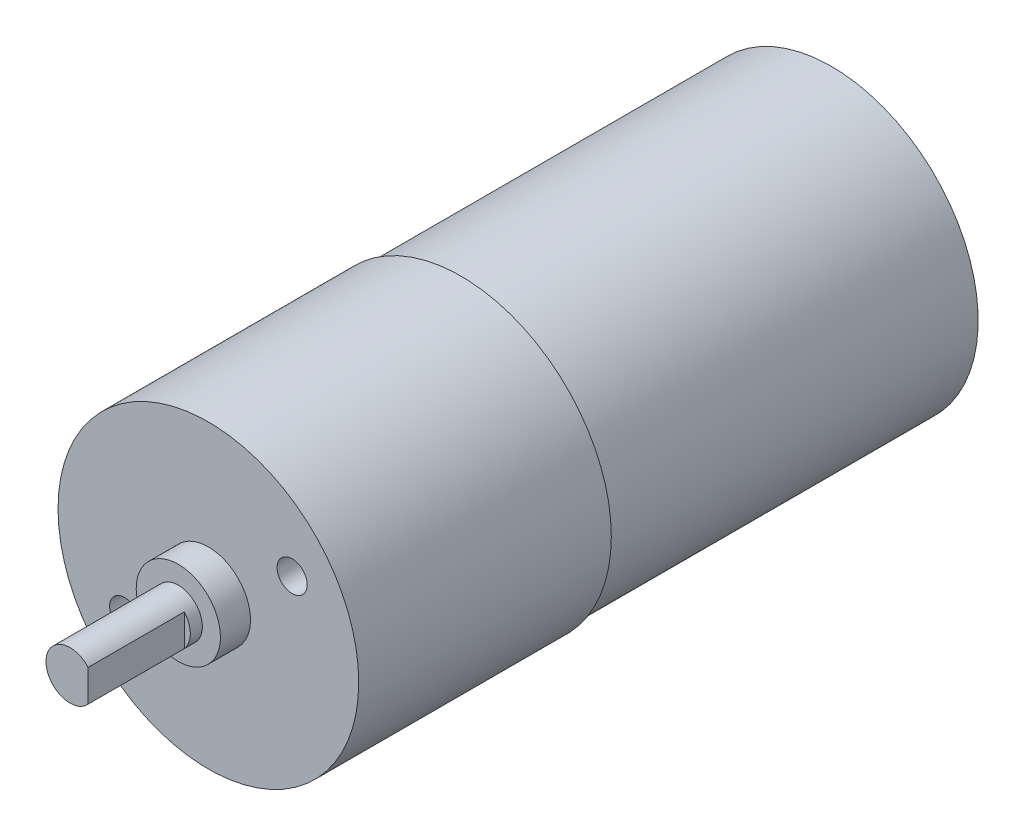
ISO-10303-21;
HEADER;
FILE_DESCRIPTION(('STEP AP214'),'2;1');
FILE_NAME('part.step','',(''),(''),'','','');
FILE_SCHEMA(('AUTOMOTIVE_DESIGN { 1 0 10303 214 1 1 1 1 }'));
ENDSEC;
DATA;
#1=APPLICATION_CONTEXT('core data for automotive mechanical design processes');
#2=APPLICATION_PROTOCOL_DEFINITION('international standard','automotive_design',2000,#1);
#3=PRODUCT_CONTEXT('',#1,'mechanical');
#4=PRODUCT('Part','Part','',(#3));
#5=PRODUCT_RELATED_PRODUCT_CATEGORY('part','',(#4));
#6=PRODUCT_DEFINITION_FORMATION('','',#4);
#7=PRODUCT_DEFINITION_CONTEXT('part definition',#1,'design');
#8=PRODUCT_DEFINITION('design','',#6,#7);
#9=PRODUCT_DEFINITION_SHAPE('','',#8);
#10=(LENGTH_UNIT() NAMED_UNIT(*) SI_UNIT(.MILLI.,.METRE.));
#11=(NAMED_UNIT(*) PLANE_ANGLE_UNIT() SI_UNIT($,.RADIAN.));
#12=(NAMED_UNIT(*) SI_UNIT($,.STERADIAN.) SOLID_ANGLE_UNIT());
#13=UNCERTAINTY_MEASURE_WITH_UNIT(LENGTH_MEASURE(1.E-05),#10,'distance_accuracy_value','');
#14=(GEOMETRIC_REPRESENTATION_CONTEXT(3) GLOBAL_UNCERTAINTY_ASSIGNED_CONTEXT((#13)) GLOBAL_UNIT_ASSIGNED_CONTEXT((#10,
#11,#12)) REPRESENTATION_CONTEXT('',''));
#15=CARTESIAN_POINT('',(0.,0.,0.));
#16=DIRECTION('',(0.,0.,1.));
#17=DIRECTION('',(1.,0.,0.));
#18=AXIS2_PLACEMENT_3D('',#15,#16,#17);
#19=CARTESIAN_POINT('',(0.,0.,11.5));
#20=DIRECTION('',(0.,0.,-1.));
#21=DIRECTION('',(-1.,0.,0.));
#22=AXIS2_PLACEMENT_3D('',#19,#20,#21);
#23=PLANE('',#22);
#24=CARTESIAN_POINT('',(0.,0.,11.5));
#25=DIRECTION('',(0.,0.,-1.));
#26=DIRECTION('',(-1.,0.,0.));
#27=AXIS2_PLACEMENT_3D('',#24,#25,#26);
#28=CIRCLE('',#27,2.);
#29=CARTESIAN_POINT('',(1.5,-1.3228756555323,11.5));
#30=VERTEX_POINT('',#29);
#31=CARTESIAN_POINT('',(1.5,1.3228756555323,11.5));
#32=VERTEX_POINT('',#31);
#33=EDGE_CURVE('E70',#30,#32,#28,.T.);
#34=ORIENTED_EDGE('',*,*,#33,.F.);
#35=DIRECTION('',(0.,1.,0.));
#36=VECTOR('',#35,1.);
#37=CARTESIAN_POINT('',(1.5,0.,11.5));
#38=LINE('',#37,#36);
#39=EDGE_CURVE('E69',#30,#32,#38,.T.);
#40=ORIENTED_EDGE('',*,*,#39,.T.);
#41=EDGE_LOOP('',(#34,#40));
#42=FACE_BOUND('',#41,.T.);
#43=ADVANCED_FACE('F39',(#42),#23,.F.);
#44=CARTESIAN_POINT('',(0.,0.,-60.));
#45=DIRECTION('',(0.,0.,-1.));
#46=DIRECTION('',(-1.,0.,0.));
#47=AXIS2_PLACEMENT_3D('',#44,#45,#46);
#48=CYLINDRICAL_SURFACE('',#47,2.);
#49=ORIENTED_EDGE('',*,*,#33,.T.);
#50=DIRECTION('',(0.,0.,-1.));
#51=VECTOR('',#50,1.);
#52=CARTESIAN_POINT('',(1.5,1.3228756555323,-60.));
#53=LINE('',#52,#51);
#54=CARTESIAN_POINT('',(1.5,1.3228756555323,3.5));
#55=VERTEX_POINT('',#54);
#56=EDGE_CURVE('E11',#32,#55,#53,.T.);
#57=ORIENTED_EDGE('',*,*,#56,.T.);
#58=CARTESIAN_POINT('',(0.,0.,3.5));
#59=DIRECTION('',(0.,0.,-1.));
#60=DIRECTION('',(-1.,0.,0.));
#61=AXIS2_PLACEMENT_3D('',#58,#59,#60);
#62=CIRCLE('',#61,2.);
#63=CARTESIAN_POINT('',(1.5,-1.3228756555323,3.5));
#64=VERTEX_POINT('',#63);
#65=EDGE_CURVE('E64',#55,#64,#62,.T.);
#66=ORIENTED_EDGE('',*,*,#65,.T.);
#67=DIRECTION('',(0.,0.,-1.));
#68=VECTOR('',#67,1.);
#69=CARTESIAN_POINT('',(1.5,-1.3228756555323,-60.));
#70=LINE('',#69,#68);
#71=EDGE_CURVE('E46',#64,#30,#70,.F.);
#72=ORIENTED_EDGE('',*,*,#71,.T.);
#73=EDGE_LOOP('',(#49,#57,#66,#72));
#74=FACE_BOUND('',#73,.T.);
#75=CARTESIAN_POINT('',(0.,0.,2.5));
#76=DIRECTION('',(0.,0.,-1.));
#77=DIRECTION('',(-1.,0.,0.));
#78=AXIS2_PLACEMENT_3D('',#75,#76,#77);
#79=CIRCLE('',#78,2.);
#80=CARTESIAN_POINT('',(-2.,0.,2.5));
#81=VERTEX_POINT('',#80);
#82=EDGE_CURVE('E78',#81,#81,#79,.T.);
#83=ORIENTED_EDGE('',*,*,#82,.F.);
#84=EDGE_LOOP('',(#83));
#85=FACE_BOUND('',#84,.T.);
#86=ADVANCED_FACE('F73',(#74,#85),#48,.T.);
#87=CARTESIAN_POINT('',(2.,0.,2.5));
#88=DIRECTION('',(0.,0.,-1.));
#89=DIRECTION('',(-1.,0.,0.));
#90=AXIS2_PLACEMENT_3D('',#87,#88,#89);
#91=PLANE('',#90);
#92=CARTESIAN_POINT('',(0.,0.,2.5));
#93=DIRECTION('',(0.,0.,-1.));
#94=DIRECTION('',(-1.,0.,0.));
#95=AXIS2_PLACEMENT_3D('',#92,#93,#94);
#96=CIRCLE('',#95,3.5);
#97=CARTESIAN_POINT('',(-3.5,0.,2.5));
#98=VERTEX_POINT('',#97);
#99=EDGE_CURVE('E82',#98,#98,#96,.T.);
#100=ORIENTED_EDGE('',*,*,#99,.F.);
#101=EDGE_LOOP('',(#100));
#102=FACE_BOUND('',#101,.T.);
#103=ORIENTED_EDGE('',*,*,#82,.T.);
#104=EDGE_LOOP('',(#103));
#105=FACE_BOUND('',#104,.T.);
#106=ADVANCED_FACE('F140',(#102,#105),#91,.F.);
#107=CARTESIAN_POINT('',(0.,0.,-60.));
#108=DIRECTION('',(0.,0.,-1.));
#109=DIRECTION('',(-1.,0.,0.));
#110=AXIS2_PLACEMENT_3D('',#107,#108,#109);
#111=CYLINDRICAL_SURFACE('',#110,3.5);
#112=CARTESIAN_POINT('',(0.,0.,0.));
#113=DIRECTION('',(0.,0.,-1.));
#114=DIRECTION('',(-1.,0.,0.));
#115=AXIS2_PLACEMENT_3D('',#112,#113,#114);
#116=CIRCLE('',#115,3.5);
#117=CARTESIAN_POINT('',(-3.5,0.,0.));
#118=VERTEX_POINT('',#117);
#119=EDGE_CURVE('E87',#118,#118,#116,.T.);
#120=ORIENTED_EDGE('',*,*,#119,.F.);
#121=EDGE_LOOP('',(#120));
#122=FACE_BOUND('',#121,.T.);
#123=ORIENTED_EDGE('',*,*,#99,.T.);
#124=EDGE_LOOP('',(#123));
#125=FACE_BOUND('',#124,.T.);
#126=ADVANCED_FACE('F130',(#122,#125),#111,.T.);
#127=CARTESIAN_POINT('',(3.5,0.,0.));
#128=DIRECTION('',(0.,0.,-1.));
#129=DIRECTION('',(-1.,0.,0.));
#130=AXIS2_PLACEMENT_3D('',#127,#128,#129);
#131=PLANE('',#130);
#132=CARTESIAN_POINT('',(6.96279237645643,4.87539970898389,0.));
#133=DIRECTION('',(0.,0.,1.));
#134=DIRECTION('',(1.,0.,0.));
#135=AXIS2_PLACEMENT_3D('',#132,#133,#134);
#136=CIRCLE('',#135,1.25);
#137=CARTESIAN_POINT('',(8.21279237645643,4.87539970898389,0.));
#138=VERTEX_POINT('',#137);
#139=EDGE_CURVE('E106',#138,#138,#136,.T.);
#140=ORIENTED_EDGE('',*,*,#139,.F.);
#141=EDGE_LOOP('',(#140));
#142=FACE_BOUND('',#141,.T.);
#143=CARTESIAN_POINT('',(-6.96279237645643,-4.87539970898389,0.));
#144=DIRECTION('',(0.,0.,1.));
#145=DIRECTION('',(1.,0.,0.));
#146=AXIS2_PLACEMENT_3D('',#143,#144,#145);
#147=CIRCLE('',#146,1.25);
#148=CARTESIAN_POINT('',(-5.71279237645643,-4.87539970898389,0.));
#149=VERTEX_POINT('',#148);
#150=EDGE_CURVE('E101',#149,#149,#147,.T.);
#151=ORIENTED_EDGE('',*,*,#150,.F.);
#152=EDGE_LOOP('',(#151));
#153=FACE_BOUND('',#152,.T.);
#154=CARTESIAN_POINT('',(0.,0.,0.));
#155=DIRECTION('',(0.,0.,-1.));
#156=DIRECTION('',(-1.,0.,0.));
#157=AXIS2_PLACEMENT_3D('',#154,#155,#156);
#158=CIRCLE('',#157,12.5);
#159=CARTESIAN_POINT('',(-12.5,0.,0.));
#160=VERTEX_POINT('',#159);
#161=EDGE_CURVE('E86',#160,#160,#158,.T.);
#162=ORIENTED_EDGE('',*,*,#161,.F.);
#163=EDGE_LOOP('',(#162));
#164=FACE_BOUND('',#163,.T.);
#165=ORIENTED_EDGE('',*,*,#119,.T.);
#166=EDGE_LOOP('',(#165));
#167=FACE_BOUND('',#166,.T.);
#168=ADVANCED_FACE('F123',(#142,#153,#164,#167),#131,.F.);
#169=CARTESIAN_POINT('',(0.,0.,-60.));
#170=DIRECTION('',(0.,0.,-1.));
#171=DIRECTION('',(-1.,0.,0.));
#172=AXIS2_PLACEMENT_3D('',#169,#170,#171);
#173=CYLINDRICAL_SURFACE('',#172,12.5);
#174=CARTESIAN_POINT('',(0.,0.,-21.));
#175=DIRECTION('',(0.,0.,-1.));
#176=DIRECTION('',(-1.,0.,0.));
#177=AXIS2_PLACEMENT_3D('',#174,#175,#176);
#178=CIRCLE('',#177,12.5);
#179=CARTESIAN_POINT('',(-12.5,0.,-21.));
#180=VERTEX_POINT('',#179);
#181=EDGE_CURVE('E95',#180,#180,#178,.T.);
#182=ORIENTED_EDGE('',*,*,#181,.F.);
#183=EDGE_LOOP('',(#182));
#184=FACE_BOUND('',#183,.T.);
#185=ORIENTED_EDGE('',*,*,#161,.T.);
#186=EDGE_LOOP('',(#185));
#187=FACE_BOUND('',#186,.T.);
#188=ADVANCED_FACE('F126',(#184,#187),#173,.T.);
#189=CARTESIAN_POINT('',(12.5,0.,-21.));
#190=DIRECTION('',(0.,0.,1.));
#191=DIRECTION('',(1.,0.,0.));
#192=AXIS2_PLACEMENT_3D('',#189,#190,#191);
#193=PLANE('',#192);
#194=CARTESIAN_POINT('',(0.,0.,-21.));
#195=DIRECTION('',(0.,0.,-1.));
#196=DIRECTION('',(-1.,0.,0.));
#197=AXIS2_PLACEMENT_3D('',#194,#195,#196);
#198=CIRCLE('',#197,12.2);
#199=CARTESIAN_POINT('',(-12.2,0.,-21.));
#200=VERTEX_POINT('',#199);
#201=EDGE_CURVE('E94',#200,#200,#198,.T.);
#202=ORIENTED_EDGE('',*,*,#201,.F.);
#203=EDGE_LOOP('',(#202));
#204=FACE_BOUND('',#203,.T.);
#205=ORIENTED_EDGE('',*,*,#181,.T.);
#206=EDGE_LOOP('',(#205));
#207=FACE_BOUND('',#206,.T.);
#208=ADVANCED_FACE('F153',(#204,#207),#193,.F.);
#209=CARTESIAN_POINT('',(0.,0.,-60.));
#210=DIRECTION('',(0.,0.,-1.));
#211=DIRECTION('',(-1.,0.,0.));
#212=AXIS2_PLACEMENT_3D('',#209,#210,#211);
#213=CYLINDRICAL_SURFACE('',#212,12.2);
#214=CARTESIAN_POINT('',(0.,0.,-51.8));
#215=DIRECTION('',(0.,0.,-1.));
#216=DIRECTION('',(-1.,0.,0.));
#217=AXIS2_PLACEMENT_3D('',#214,#215,#216);
#218=CIRCLE('',#217,12.2);
#219=CARTESIAN_POINT('',(-12.2,0.,-51.8));
#220=VERTEX_POINT('',#219);
#221=EDGE_CURVE('E100',#220,#220,#218,.T.);
#222=ORIENTED_EDGE('',*,*,#221,.F.);
#223=EDGE_LOOP('',(#222));
#224=FACE_BOUND('',#223,.T.);
#225=ORIENTED_EDGE('',*,*,#201,.T.);
#226=EDGE_LOOP('',(#225));
#227=FACE_BOUND('',#226,.T.);
#228=ADVANCED_FACE('F160',(#224,#227),#213,.T.);
#229=CARTESIAN_POINT('',(12.2,0.,-51.8));
#230=DIRECTION('',(0.,0.,1.));
#231=DIRECTION('',(1.,0.,0.));
#232=AXIS2_PLACEMENT_3D('',#229,#230,#231);
#233=PLANE('',#232);
#234=ORIENTED_EDGE('',*,*,#221,.T.);
#235=EDGE_LOOP('',(#234));
#236=FACE_BOUND('',#235,.T.);
#237=ADVANCED_FACE('F162',(#236),#233,.F.);
#238=CARTESIAN_POINT('',(1.5,-12.5,3.5));
#239=DIRECTION('',(-1.,0.,0.));
#240=DIRECTION('',(0.,0.,1.));
#241=AXIS2_PLACEMENT_3D('',#238,#239,#240);
#242=PLANE('',#241);
#243=ORIENTED_EDGE('',*,*,#39,.F.);
#244=ORIENTED_EDGE('',*,*,#71,.F.);
#245=DIRECTION('',(0.,1.,0.));
#246=VECTOR('',#245,1.);
#247=CARTESIAN_POINT('',(1.5,-12.5,3.5));
#248=LINE('',#247,#246);
#249=EDGE_CURVE('E55',#64,#55,#248,.T.);
#250=ORIENTED_EDGE('',*,*,#249,.T.);
#251=ORIENTED_EDGE('',*,*,#56,.F.);
#252=EDGE_LOOP('',(#243,#244,#250,#251));
#253=FACE_BOUND('',#252,.T.);
#254=ADVANCED_FACE('F67',(#253),#242,.F.);
#255=CARTESIAN_POINT('',(1.5,-12.5,3.5));
#256=DIRECTION('',(0.,0.,-1.));
#257=DIRECTION('',(-1.,0.,0.));
#258=AXIS2_PLACEMENT_3D('',#255,#256,#257);
#259=PLANE('',#258);
#260=ORIENTED_EDGE('',*,*,#249,.F.);
#261=ORIENTED_EDGE('',*,*,#65,.F.);
#262=EDGE_LOOP('',(#260,#261));
#263=FACE_BOUND('',#262,.T.);
#264=ADVANCED_FACE('F61',(#263),#259,.F.);
#265=CARTESIAN_POINT('',(-6.96279237645643,-4.87539970898389,-3.5));
#266=DIRECTION('',(0.,0.,1.));
#267=DIRECTION('',(1.,0.,0.));
#268=AXIS2_PLACEMENT_3D('',#265,#266,#267);
#269=CYLINDRICAL_SURFACE('',#268,1.25);
#270=CARTESIAN_POINT('',(-6.96279237645643,-4.87539970898389,-3.5));
#271=DIRECTION('',(0.,0.,1.));
#272=DIRECTION('',(1.,0.,0.));
#273=AXIS2_PLACEMENT_3D('',#270,#271,#272);
#274=CIRCLE('',#273,1.25);
#275=CARTESIAN_POINT('',(-5.71279237645643,-4.87539970898389,-3.5));
#276=VERTEX_POINT('',#275);
#277=EDGE_CURVE('E105',#276,#276,#274,.T.);
#278=ORIENTED_EDGE('',*,*,#277,.F.);
#279=EDGE_LOOP('',(#278));
#280=FACE_BOUND('',#279,.T.);
#281=ORIENTED_EDGE('',*,*,#150,.T.);
#282=EDGE_LOOP('',(#281));
#283=FACE_BOUND('',#282,.T.);
#284=ADVANCED_FACE('F167',(#280,#283),#269,.F.);
#285=CARTESIAN_POINT('',(-6.96279237645643,-4.87539970898389,-3.5));
#286=DIRECTION('',(0.,0.,1.));
#287=DIRECTION('',(1.,0.,0.));
#288=AXIS2_PLACEMENT_3D('',#285,#286,#287);
#289=PLANE('',#288);
#290=ORIENTED_EDGE('',*,*,#277,.T.);
#291=EDGE_LOOP('',(#290));
#292=FACE_BOUND('',#291,.T.);
#293=ADVANCED_FACE('F117',(#292),#289,.T.);
#294=CARTESIAN_POINT('',(6.96279237645643,4.87539970898389,-3.5));
#295=DIRECTION('',(0.,0.,1.));
#296=DIRECTION('',(1.,0.,0.));
#297=AXIS2_PLACEMENT_3D('',#294,#295,#296);
#298=CYLINDRICAL_SURFACE('',#297,1.25);
#299=CARTESIAN_POINT('',(6.96279237645643,4.87539970898389,-3.5));
#300=DIRECTION('',(0.,0.,1.));
#301=DIRECTION('',(1.,0.,0.));
#302=AXIS2_PLACEMENT_3D('',#299,#300,#301);
#303=CIRCLE('',#302,1.25);
#304=CARTESIAN_POINT('',(8.21279237645643,4.87539970898389,-3.5));
#305=VERTEX_POINT('',#304);
#306=EDGE_CURVE('E74',#305,#305,#303,.T.);
#307=ORIENTED_EDGE('',*,*,#306,.F.);
#308=EDGE_LOOP('',(#307));
#309=FACE_BOUND('',#308,.T.);
#310=ORIENTED_EDGE('',*,*,#139,.T.);
#311=EDGE_LOOP('',(#310));
#312=FACE_BOUND('',#311,.T.);
#313=ADVANCED_FACE('F116',(#309,#312),#298,.F.);
#314=CARTESIAN_POINT('',(6.96279237645643,4.87539970898389,-3.5));
#315=DIRECTION('',(0.,0.,1.));
#316=DIRECTION('',(1.,0.,0.));
#317=AXIS2_PLACEMENT_3D('',#314,#315,#316);
#318=PLANE('',#317);
#319=ORIENTED_EDGE('',*,*,#306,.T.);
#320=EDGE_LOOP('',(#319));
#321=FACE_BOUND('',#320,.T.);
#322=ADVANCED_FACE('F114',(#321),#318,.T.);
#323=CLOSED_SHELL('',(#43,#86,#106,#126,#168,#188,#208,#228,#237,#254,#264,#284,#293,#313,#322));
#324=MANIFOLD_SOLID_BREP('B2',#323);
#325=ADVANCED_BREP_SHAPE_REPRESENTATION('',(#18,#324),#14);
#326=SHAPE_DEFINITION_REPRESENTATION(#9,#325);
ENDSEC;
END-ISO-10303-21;
